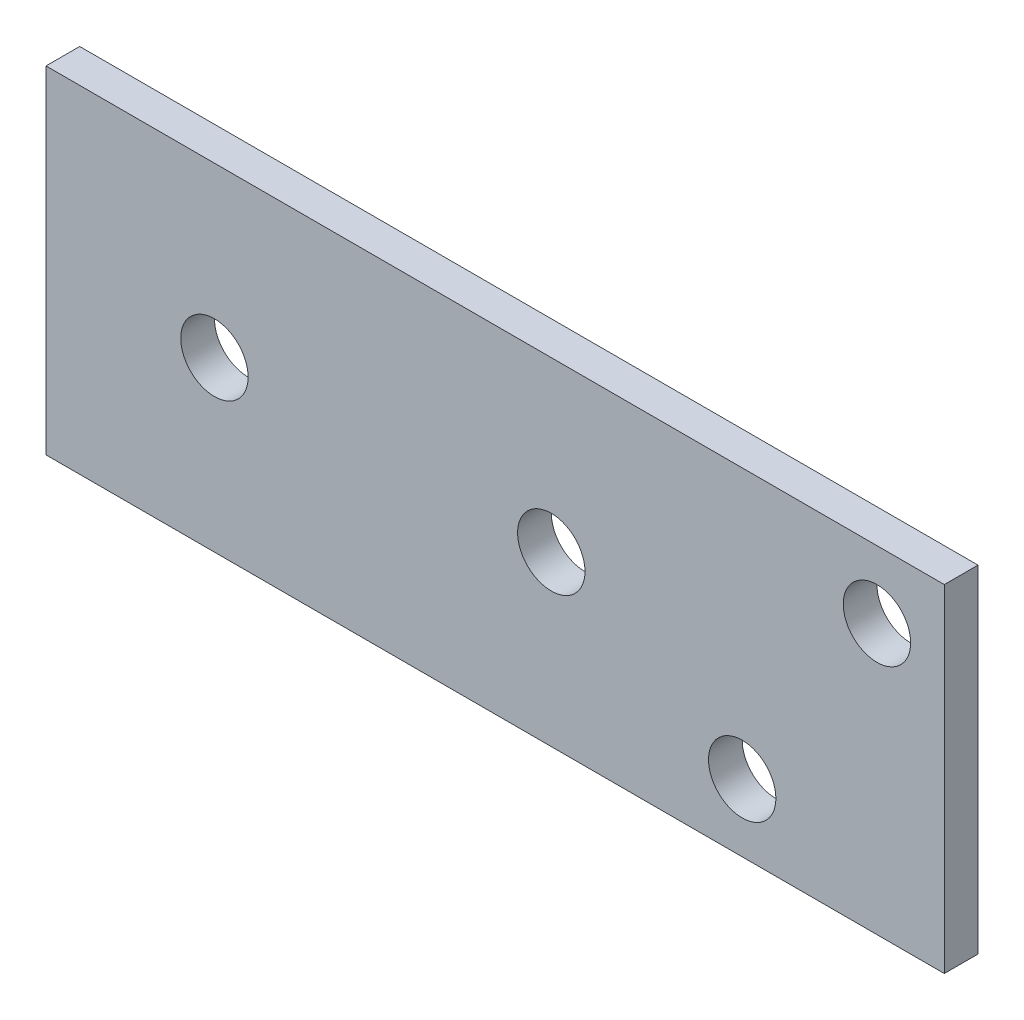
ISO-10303-21;
HEADER;
FILE_DESCRIPTION(('STEP AP214'),'2;1');
FILE_NAME('part.step','',(''),(''),'','','');
FILE_SCHEMA(('AUTOMOTIVE_DESIGN { 1 0 10303 214 1 1 1 1 }'));
ENDSEC;
DATA;
#1=APPLICATION_CONTEXT('core data for automotive mechanical design processes');
#2=APPLICATION_PROTOCOL_DEFINITION('international standard','automotive_design',2000,#1);
#3=PRODUCT_CONTEXT('',#1,'mechanical');
#4=PRODUCT('Part','Part','',(#3));
#5=PRODUCT_RELATED_PRODUCT_CATEGORY('part','',(#4));
#6=PRODUCT_DEFINITION_FORMATION('','',#4);
#7=PRODUCT_DEFINITION_CONTEXT('part definition',#1,'design');
#8=PRODUCT_DEFINITION('design','',#6,#7);
#9=PRODUCT_DEFINITION_SHAPE('','',#8);
#10=(LENGTH_UNIT() NAMED_UNIT(*) SI_UNIT(.MILLI.,.METRE.));
#11=(NAMED_UNIT(*) PLANE_ANGLE_UNIT() SI_UNIT($,.RADIAN.));
#12=(NAMED_UNIT(*) SI_UNIT($,.STERADIAN.) SOLID_ANGLE_UNIT());
#13=UNCERTAINTY_MEASURE_WITH_UNIT(LENGTH_MEASURE(1.E-05),#10,'distance_accuracy_value','');
#14=(GEOMETRIC_REPRESENTATION_CONTEXT(3) GLOBAL_UNCERTAINTY_ASSIGNED_CONTEXT((#13)) GLOBAL_UNIT_ASSIGNED_CONTEXT((#10,
#11,#12)) REPRESENTATION_CONTEXT('',''));
#15=CARTESIAN_POINT('',(0.,0.,0.));
#16=DIRECTION('',(0.,0.,1.));
#17=DIRECTION('',(1.,0.,0.));
#18=AXIS2_PLACEMENT_3D('',#15,#16,#17);
#19=CARTESIAN_POINT('',(-27.9101879188982,-3.55626992561105,1.5));
#20=DIRECTION('',(0.,0.,1.));
#21=DIRECTION('',(1.,0.,0.));
#22=AXIS2_PLACEMENT_3D('',#19,#20,#21);
#23=PLANE('',#22);
#24=CARTESIAN_POINT('',(3.08981208110185,-0.556269925611047,1.5));
#25=DIRECTION('',(0.,0.,1.));
#26=DIRECTION('',(1.,0.,0.));
#27=AXIS2_PLACEMENT_3D('',#24,#25,#26);
#28=CIRCLE('',#27,1.5);
#29=CARTESIAN_POINT('',(4.58981208110185,-0.556269925611047,1.5));
#30=VERTEX_POINT('',#29);
#31=EDGE_CURVE('E127',#30,#30,#28,.T.);
#32=ORIENTED_EDGE('',*,*,#31,.F.);
#33=EDGE_LOOP('',(#32));
#34=FACE_BOUND('',#33,.T.);
#35=CARTESIAN_POINT('',(9.08981208110185,8.44373007438895,1.5));
#36=DIRECTION('',(0.,0.,1.));
#37=DIRECTION('',(1.,0.,0.));
#38=AXIS2_PLACEMENT_3D('',#35,#36,#37);
#39=CIRCLE('',#38,1.5);
#40=CARTESIAN_POINT('',(10.5898120811018,8.44373007438895,1.5));
#41=VERTEX_POINT('',#40);
#42=EDGE_CURVE('E121',#41,#41,#39,.T.);
#43=ORIENTED_EDGE('',*,*,#42,.F.);
#44=EDGE_LOOP('',(#43));
#45=FACE_BOUND('',#44,.T.);
#46=CARTESIAN_POINT('',(-20.4101879188982,3.94373007438895,1.5));
#47=DIRECTION('',(0.,0.,1.));
#48=DIRECTION('',(1.,0.,0.));
#49=AXIS2_PLACEMENT_3D('',#46,#47,#48);
#50=CIRCLE('',#49,1.5);
#51=CARTESIAN_POINT('',(-18.9101879188982,3.94373007438895,1.5));
#52=VERTEX_POINT('',#51);
#53=EDGE_CURVE('E97',#52,#52,#50,.T.);
#54=ORIENTED_EDGE('',*,*,#53,.F.);
#55=EDGE_LOOP('',(#54));
#56=FACE_BOUND('',#55,.T.);
#57=DIRECTION('',(0.,-1.,0.));
#58=VECTOR('',#57,1.);
#59=CARTESIAN_POINT('',(-27.9101879188982,11.443730074389,1.5));
#60=LINE('',#59,#58);
#61=CARTESIAN_POINT('',(-27.9101879188982,11.443730074389,1.5));
#62=VERTEX_POINT('',#61);
#63=CARTESIAN_POINT('',(-27.9101879188982,-3.55626992561105,1.5));
#64=VERTEX_POINT('',#63);
#65=EDGE_CURVE('E82',#62,#64,#60,.T.);
#66=ORIENTED_EDGE('',*,*,#65,.T.);
#67=DIRECTION('',(1.,0.,0.));
#68=VECTOR('',#67,1.);
#69=CARTESIAN_POINT('',(-27.9101879188982,-3.55626992561105,1.5));
#70=LINE('',#69,#68);
#71=CARTESIAN_POINT('',(12.0898120811018,-3.55626992561105,1.5));
#72=VERTEX_POINT('',#71);
#73=EDGE_CURVE('E77',#64,#72,#70,.T.);
#74=ORIENTED_EDGE('',*,*,#73,.T.);
#75=DIRECTION('',(0.,1.,0.));
#76=VECTOR('',#75,1.);
#77=CARTESIAN_POINT('',(12.0898120811018,11.443730074389,1.5));
#78=LINE('',#77,#76);
#79=CARTESIAN_POINT('',(12.0898120811018,11.443730074389,1.5));
#80=VERTEX_POINT('',#79);
#81=EDGE_CURVE('E80',#72,#80,#78,.T.);
#82=ORIENTED_EDGE('',*,*,#81,.T.);
#83=DIRECTION('',(-1.,0.,0.));
#84=VECTOR('',#83,1.);
#85=CARTESIAN_POINT('',(-27.9101879188982,11.443730074389,1.5));
#86=LINE('',#85,#84);
#87=EDGE_CURVE('E47',#80,#62,#86,.T.);
#88=ORIENTED_EDGE('',*,*,#87,.T.);
#89=EDGE_LOOP('',(#66,#74,#82,#88));
#90=FACE_BOUND('',#89,.T.);
#91=CARTESIAN_POINT('',(-5.41018791889816,3.94373007438895,1.5));
#92=DIRECTION('',(0.,0.,1.));
#93=DIRECTION('',(1.,0.,0.));
#94=AXIS2_PLACEMENT_3D('',#91,#92,#93);
#95=CIRCLE('',#94,1.5);
#96=CARTESIAN_POINT('',(-3.91018791889816,3.94373007438895,1.5));
#97=VERTEX_POINT('',#96);
#98=EDGE_CURVE('E112',#97,#97,#95,.T.);
#99=ORIENTED_EDGE('',*,*,#98,.F.);
#100=EDGE_LOOP('',(#99));
#101=FACE_BOUND('',#100,.T.);
#102=ADVANCED_FACE('F30',(#34,#45,#56,#90,#101),#23,.T.);
#103=CARTESIAN_POINT('',(-27.9101879188982,-3.55626992561105,0.));
#104=DIRECTION('',(0.,0.,1.));
#105=DIRECTION('',(1.,0.,0.));
#106=AXIS2_PLACEMENT_3D('',#103,#104,#105);
#107=PLANE('',#106);
#108=CARTESIAN_POINT('',(3.08981208110185,-0.556269925611047,0.));
#109=DIRECTION('',(0.,0.,1.));
#110=DIRECTION('',(1.,0.,0.));
#111=AXIS2_PLACEMENT_3D('',#108,#109,#110);
#112=CIRCLE('',#111,1.5);
#113=CARTESIAN_POINT('',(4.58981208110185,-0.556269925611047,0.));
#114=VERTEX_POINT('',#113);
#115=EDGE_CURVE('E124',#114,#114,#112,.T.);
#116=ORIENTED_EDGE('',*,*,#115,.T.);
#117=EDGE_LOOP('',(#116));
#118=FACE_BOUND('',#117,.T.);
#119=CARTESIAN_POINT('',(9.08981208110185,8.44373007438895,0.));
#120=DIRECTION('',(0.,0.,1.));
#121=DIRECTION('',(1.,0.,0.));
#122=AXIS2_PLACEMENT_3D('',#119,#120,#121);
#123=CIRCLE('',#122,1.5);
#124=CARTESIAN_POINT('',(10.5898120811018,8.44373007438895,0.));
#125=VERTEX_POINT('',#124);
#126=EDGE_CURVE('E118',#125,#125,#123,.T.);
#127=ORIENTED_EDGE('',*,*,#126,.T.);
#128=EDGE_LOOP('',(#127));
#129=FACE_BOUND('',#128,.T.);
#130=CARTESIAN_POINT('',(-20.4101879188982,3.94373007438895,0.));
#131=DIRECTION('',(0.,0.,1.));
#132=DIRECTION('',(1.,0.,0.));
#133=AXIS2_PLACEMENT_3D('',#130,#131,#132);
#134=CIRCLE('',#133,1.5);
#135=CARTESIAN_POINT('',(-18.9101879188982,3.94373007438895,0.));
#136=VERTEX_POINT('',#135);
#137=EDGE_CURVE('E109',#136,#136,#134,.T.);
#138=ORIENTED_EDGE('',*,*,#137,.T.);
#139=EDGE_LOOP('',(#138));
#140=FACE_BOUND('',#139,.T.);
#141=DIRECTION('',(0.,-1.,0.));
#142=VECTOR('',#141,1.);
#143=CARTESIAN_POINT('',(-27.9101879188982,11.443730074389,0.));
#144=LINE('',#143,#142);
#145=CARTESIAN_POINT('',(-27.9101879188982,11.443730074389,0.));
#146=VERTEX_POINT('',#145);
#147=CARTESIAN_POINT('',(-27.9101879188982,-3.55626992561105,0.));
#148=VERTEX_POINT('',#147);
#149=EDGE_CURVE('E94',#146,#148,#144,.T.);
#150=ORIENTED_EDGE('',*,*,#149,.F.);
#151=DIRECTION('',(-1.,0.,0.));
#152=VECTOR('',#151,1.);
#153=CARTESIAN_POINT('',(-27.9101879188982,11.443730074389,0.));
#154=LINE('',#153,#152);
#155=CARTESIAN_POINT('',(12.0898120811018,11.443730074389,0.));
#156=VERTEX_POINT('',#155);
#157=EDGE_CURVE('E70',#156,#146,#154,.T.);
#158=ORIENTED_EDGE('',*,*,#157,.F.);
#159=DIRECTION('',(0.,1.,0.));
#160=VECTOR('',#159,1.);
#161=CARTESIAN_POINT('',(12.0898120811018,11.443730074389,0.));
#162=LINE('',#161,#160);
#163=CARTESIAN_POINT('',(12.0898120811018,-3.55626992561105,0.));
#164=VERTEX_POINT('',#163);
#165=EDGE_CURVE('E64',#164,#156,#162,.T.);
#166=ORIENTED_EDGE('',*,*,#165,.F.);
#167=DIRECTION('',(1.,0.,0.));
#168=VECTOR('',#167,1.);
#169=CARTESIAN_POINT('',(-27.9101879188982,-3.55626992561105,0.));
#170=LINE('',#169,#168);
#171=EDGE_CURVE('E86',#148,#164,#170,.T.);
#172=ORIENTED_EDGE('',*,*,#171,.F.);
#173=EDGE_LOOP('',(#150,#158,#166,#172));
#174=FACE_BOUND('',#173,.T.);
#175=CARTESIAN_POINT('',(-5.41018791889816,3.94373007438895,0.));
#176=DIRECTION('',(0.,0.,1.));
#177=DIRECTION('',(1.,0.,0.));
#178=AXIS2_PLACEMENT_3D('',#175,#176,#177);
#179=CIRCLE('',#178,1.5);
#180=CARTESIAN_POINT('',(-3.91018791889816,3.94373007438895,0.));
#181=VERTEX_POINT('',#180);
#182=EDGE_CURVE('E115',#181,#181,#179,.T.);
#183=ORIENTED_EDGE('',*,*,#182,.T.);
#184=EDGE_LOOP('',(#183));
#185=FACE_BOUND('',#184,.T.);
#186=ADVANCED_FACE('F105',(#118,#129,#140,#174,#185),#107,.F.);
#187=CARTESIAN_POINT('',(-27.9101879188982,11.443730074389,1.5));
#188=DIRECTION('',(1.,0.,0.));
#189=DIRECTION('',(0.,0.,-1.));
#190=AXIS2_PLACEMENT_3D('',#187,#188,#189);
#191=PLANE('',#190);
#192=ORIENTED_EDGE('',*,*,#149,.T.);
#193=DIRECTION('',(0.,0.,-1.));
#194=VECTOR('',#193,1.);
#195=CARTESIAN_POINT('',(-27.9101879188982,-3.55626992561105,1.5));
#196=LINE('',#195,#194);
#197=EDGE_CURVE('E11',#64,#148,#196,.T.);
#198=ORIENTED_EDGE('',*,*,#197,.F.);
#199=ORIENTED_EDGE('',*,*,#65,.F.);
#200=DIRECTION('',(0.,0.,-1.));
#201=VECTOR('',#200,1.);
#202=CARTESIAN_POINT('',(-27.9101879188982,11.443730074389,1.5));
#203=LINE('',#202,#201);
#204=EDGE_CURVE('E90',#62,#146,#203,.T.);
#205=ORIENTED_EDGE('',*,*,#204,.T.);
#206=EDGE_LOOP('',(#192,#198,#199,#205));
#207=FACE_BOUND('',#206,.T.);
#208=ADVANCED_FACE('F32',(#207),#191,.F.);
#209=CARTESIAN_POINT('',(-27.9101879188982,-3.55626992561105,1.5));
#210=DIRECTION('',(0.,1.,0.));
#211=DIRECTION('',(0.,0.,1.));
#212=AXIS2_PLACEMENT_3D('',#209,#210,#211);
#213=PLANE('',#212);
#214=ORIENTED_EDGE('',*,*,#171,.T.);
#215=DIRECTION('',(0.,0.,-1.));
#216=VECTOR('',#215,1.);
#217=CARTESIAN_POINT('',(12.0898120811018,-3.55626992561105,1.5));
#218=LINE('',#217,#216);
#219=EDGE_CURVE('E39',#72,#164,#218,.T.);
#220=ORIENTED_EDGE('',*,*,#219,.F.);
#221=ORIENTED_EDGE('',*,*,#73,.F.);
#222=ORIENTED_EDGE('',*,*,#197,.T.);
#223=EDGE_LOOP('',(#214,#220,#221,#222));
#224=FACE_BOUND('',#223,.T.);
#225=ADVANCED_FACE('F85',(#224),#213,.F.);
#226=CARTESIAN_POINT('',(12.0898120811018,11.443730074389,1.5));
#227=DIRECTION('',(-1.,0.,0.));
#228=DIRECTION('',(0.,0.,1.));
#229=AXIS2_PLACEMENT_3D('',#226,#227,#228);
#230=PLANE('',#229);
#231=ORIENTED_EDGE('',*,*,#165,.T.);
#232=DIRECTION('',(0.,0.,-1.));
#233=VECTOR('',#232,1.);
#234=CARTESIAN_POINT('',(12.0898120811018,11.443730074389,1.5));
#235=LINE('',#234,#233);
#236=EDGE_CURVE('E87',#80,#156,#235,.T.);
#237=ORIENTED_EDGE('',*,*,#236,.F.);
#238=ORIENTED_EDGE('',*,*,#81,.F.);
#239=ORIENTED_EDGE('',*,*,#219,.T.);
#240=EDGE_LOOP('',(#231,#237,#238,#239));
#241=FACE_BOUND('',#240,.T.);
#242=ADVANCED_FACE('F88',(#241),#230,.F.);
#243=CARTESIAN_POINT('',(-27.9101879188982,11.443730074389,1.5));
#244=DIRECTION('',(0.,-1.,0.));
#245=DIRECTION('',(0.,0.,-1.));
#246=AXIS2_PLACEMENT_3D('',#243,#244,#245);
#247=PLANE('',#246);
#248=ORIENTED_EDGE('',*,*,#157,.T.);
#249=ORIENTED_EDGE('',*,*,#204,.F.);
#250=ORIENTED_EDGE('',*,*,#87,.F.);
#251=ORIENTED_EDGE('',*,*,#236,.T.);
#252=EDGE_LOOP('',(#248,#249,#250,#251));
#253=FACE_BOUND('',#252,.T.);
#254=ADVANCED_FACE('F102',(#253),#247,.F.);
#255=CARTESIAN_POINT('',(-20.4101879188982,3.94373007438895,1.5));
#256=DIRECTION('',(0.,0.,-1.));
#257=DIRECTION('',(-1.,0.,0.));
#258=AXIS2_PLACEMENT_3D('',#255,#256,#257);
#259=CYLINDRICAL_SURFACE('',#258,1.5);
#260=ORIENTED_EDGE('',*,*,#53,.T.);
#261=EDGE_LOOP('',(#260));
#262=FACE_BOUND('',#261,.T.);
#263=ORIENTED_EDGE('',*,*,#137,.F.);
#264=EDGE_LOOP('',(#263));
#265=FACE_BOUND('',#264,.T.);
#266=ADVANCED_FACE('F149',(#262,#265),#259,.F.);
#267=CARTESIAN_POINT('',(-5.41018791889816,3.94373007438895,1.5));
#268=DIRECTION('',(0.,0.,-1.));
#269=DIRECTION('',(-1.,0.,0.));
#270=AXIS2_PLACEMENT_3D('',#267,#268,#269);
#271=CYLINDRICAL_SURFACE('',#270,1.5);
#272=ORIENTED_EDGE('',*,*,#98,.T.);
#273=EDGE_LOOP('',(#272));
#274=FACE_BOUND('',#273,.T.);
#275=ORIENTED_EDGE('',*,*,#182,.F.);
#276=EDGE_LOOP('',(#275));
#277=FACE_BOUND('',#276,.T.);
#278=ADVANCED_FACE('F152',(#274,#277),#271,.F.);
#279=CARTESIAN_POINT('',(9.08981208110185,8.44373007438895,0.));
#280=DIRECTION('',(0.,0.,1.));
#281=DIRECTION('',(1.,0.,0.));
#282=AXIS2_PLACEMENT_3D('',#279,#280,#281);
#283=CYLINDRICAL_SURFACE('',#282,1.5);
#284=ORIENTED_EDGE('',*,*,#126,.F.);
#285=EDGE_LOOP('',(#284));
#286=FACE_BOUND('',#285,.T.);
#287=ORIENTED_EDGE('',*,*,#42,.T.);
#288=EDGE_LOOP('',(#287));
#289=FACE_BOUND('',#288,.T.);
#290=ADVANCED_FACE('F138',(#286,#289),#283,.F.);
#291=CARTESIAN_POINT('',(3.08981208110185,-0.556269925611047,0.));
#292=DIRECTION('',(0.,0.,1.));
#293=DIRECTION('',(1.,0.,0.));
#294=AXIS2_PLACEMENT_3D('',#291,#292,#293);
#295=CYLINDRICAL_SURFACE('',#294,1.5);
#296=ORIENTED_EDGE('',*,*,#115,.F.);
#297=EDGE_LOOP('',(#296));
#298=FACE_BOUND('',#297,.T.);
#299=ORIENTED_EDGE('',*,*,#31,.T.);
#300=EDGE_LOOP('',(#299));
#301=FACE_BOUND('',#300,.T.);
#302=ADVANCED_FACE('F135',(#298,#301),#295,.F.);
#303=CLOSED_SHELL('',(#102,#186,#208,#225,#242,#254,#266,#278,#290,#302));
#304=MANIFOLD_SOLID_BREP('B2',#303);
#305=ADVANCED_BREP_SHAPE_REPRESENTATION('',(#18,#304),#14);
#306=SHAPE_DEFINITION_REPRESENTATION(#9,#305);
ENDSEC;
END-ISO-10303-21;
